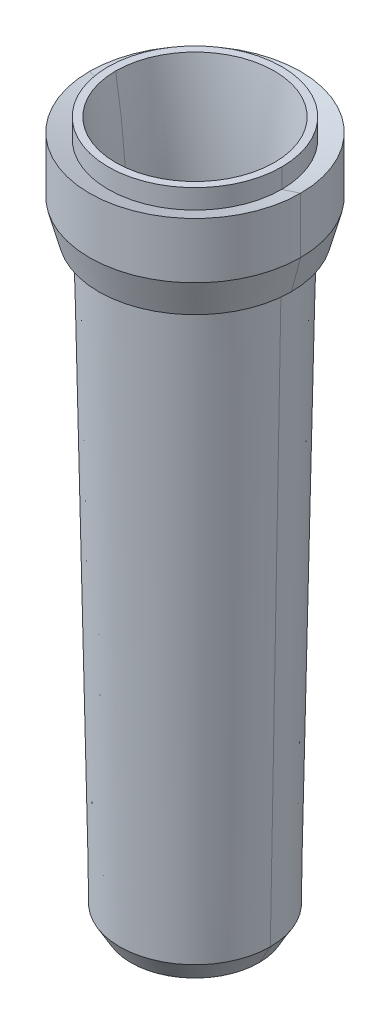
ISO-10303-21;
HEADER;
FILE_DESCRIPTION(('STEP AP214'),'2;1');
FILE_NAME('part.step','',(''),(''),'','','');
FILE_SCHEMA(('AUTOMOTIVE_DESIGN { 1 0 10303 214 1 1 1 1 }'));
ENDSEC;
DATA;
#1=APPLICATION_CONTEXT('core data for automotive mechanical design processes');
#2=APPLICATION_PROTOCOL_DEFINITION('international standard','automotive_design',2000,#1);
#3=PRODUCT_CONTEXT('',#1,'mechanical');
#4=PRODUCT('Part','Part','',(#3));
#5=PRODUCT_RELATED_PRODUCT_CATEGORY('part','',(#4));
#6=PRODUCT_DEFINITION_FORMATION('','',#4);
#7=PRODUCT_DEFINITION_CONTEXT('part definition',#1,'design');
#8=PRODUCT_DEFINITION('design','',#6,#7);
#9=PRODUCT_DEFINITION_SHAPE('','',#8);
#10=(LENGTH_UNIT() NAMED_UNIT(*) SI_UNIT(.MILLI.,.METRE.));
#11=(NAMED_UNIT(*) PLANE_ANGLE_UNIT() SI_UNIT($,.RADIAN.));
#12=(NAMED_UNIT(*) SI_UNIT($,.STERADIAN.) SOLID_ANGLE_UNIT());
#13=UNCERTAINTY_MEASURE_WITH_UNIT(LENGTH_MEASURE(1.E-05),#10,'distance_accuracy_value','');
#14=(GEOMETRIC_REPRESENTATION_CONTEXT(3) GLOBAL_UNCERTAINTY_ASSIGNED_CONTEXT((#13)) GLOBAL_UNIT_ASSIGNED_CONTEXT((#10,
#11,#12)) REPRESENTATION_CONTEXT('',''));
#15=CARTESIAN_POINT('',(0.,0.,0.));
#16=DIRECTION('',(0.,0.,1.));
#17=DIRECTION('',(1.,0.,0.));
#18=AXIS2_PLACEMENT_3D('',#15,#16,#17);
#19=CARTESIAN_POINT('',(0.,-1.57,0.));
#20=DIRECTION('',(0.,-1.,0.));
#21=DIRECTION('',(0.,0.,-1.));
#22=AXIS2_PLACEMENT_3D('',#19,#20,#21);
#23=PLANE('',#22);
#24=CARTESIAN_POINT('',(0.,-1.57,0.));
#25=DIRECTION('',(0.,-1.,0.));
#26=DIRECTION('',(1.,0.,0.));
#27=AXIS2_PLACEMENT_3D('',#24,#25,#26);
#28=CIRCLE('',#27,2.138996329813);
#29=CARTESIAN_POINT('',(2.138996329813,-1.57,0.));
#30=VERTEX_POINT('',#29);
#31=CARTESIAN_POINT('',(-2.138996329813,-1.57,0.));
#32=VERTEX_POINT('',#31);
#33=EDGE_CURVE('E11',#30,#32,#28,.T.);
#34=ORIENTED_EDGE('',*,*,#33,.T.);
#35=CARTESIAN_POINT('',(0.,-1.57,0.));
#36=DIRECTION('',(0.,1.,0.));
#37=DIRECTION('',(1.,0.,0.));
#38=AXIS2_PLACEMENT_3D('',#35,#36,#37);
#39=CIRCLE('',#38,2.138996329813);
#40=EDGE_CURVE('E157',#30,#32,#39,.T.);
#41=ORIENTED_EDGE('',*,*,#40,.F.);
#42=EDGE_LOOP('',(#34,#41));
#43=FACE_BOUND('',#42,.T.);
#44=ADVANCED_FACE('F16',(#43),#23,.T.);
#45=CARTESIAN_POINT('',(0.,-1.244448704932,0.));
#46=DIRECTION('',(0.,1.,0.));
#47=DIRECTION('',(1.,0.,0.));
#48=AXIS2_PLACEMENT_3D('',#45,#46,#47);
#49=CONICAL_SURFACE('',#48,2.326953457655,0.5235987755982);
#50=CARTESIAN_POINT('',(0.,-0.918897409864,0.));
#51=DIRECTION('',(0.,-1.,0.));
#52=DIRECTION('',(1.,0.,0.));
#53=AXIS2_PLACEMENT_3D('',#50,#51,#52);
#54=CIRCLE('',#53,2.514910585498);
#55=CARTESIAN_POINT('',(2.514910585498,-0.918897409864,0.));
#56=VERTEX_POINT('',#55);
#57=CARTESIAN_POINT('',(-2.514910585498,-0.918897409864,0.));
#58=VERTEX_POINT('',#57);
#59=EDGE_CURVE('E425',#56,#58,#54,.T.);
#60=ORIENTED_EDGE('',*,*,#59,.T.);
#61=DIRECTION('',(-0.500000000000017,0.866025403784429,0.));
#62=VECTOR('',#61,1.);
#63=CARTESIAN_POINT('',(-2.138996329813,-1.57,0.));
#64=LINE('',#63,#62);
#65=EDGE_CURVE('E411',#32,#58,#64,.T.);
#66=ORIENTED_EDGE('',*,*,#65,.F.);
#67=ORIENTED_EDGE('',*,*,#33,.F.);
#68=DIRECTION('',(0.500000000000017,0.866025403784429,0.));
#69=VECTOR('',#68,1.);
#70=CARTESIAN_POINT('',(2.138996329813,-1.57,0.));
#71=LINE('',#70,#69);
#72=EDGE_CURVE('E29',#30,#56,#71,.T.);
#73=ORIENTED_EDGE('',*,*,#72,.T.);
#74=EDGE_LOOP('',(#60,#66,#67,#73));
#75=FACE_BOUND('',#74,.T.);
#76=ADVANCED_FACE('F302',(#75),#49,.T.);
#77=CARTESIAN_POINT('',(0.,-1.244448704932,0.));
#78=DIRECTION('',(0.,1.,0.));
#79=DIRECTION('',(1.,0.,0.));
#80=AXIS2_PLACEMENT_3D('',#77,#78,#79);
#81=CONICAL_SURFACE('',#80,2.326953457655,0.5235987755982);
#82=ORIENTED_EDGE('',*,*,#40,.T.);
#83=ORIENTED_EDGE('',*,*,#65,.T.);
#84=CARTESIAN_POINT('',(0.,-0.918897409864,0.));
#85=DIRECTION('',(0.,1.,0.));
#86=DIRECTION('',(1.,0.,0.));
#87=AXIS2_PLACEMENT_3D('',#84,#85,#86);
#88=CIRCLE('',#87,2.514910585498);
#89=EDGE_CURVE('E194',#56,#58,#88,.T.);
#90=ORIENTED_EDGE('',*,*,#89,.F.);
#91=ORIENTED_EDGE('',*,*,#72,.F.);
#92=EDGE_LOOP('',(#82,#83,#90,#91));
#93=FACE_BOUND('',#92,.T.);
#94=ADVANCED_FACE('F301',(#93),#81,.T.);
#95=CARTESIAN_POINT('',(0.,0.141409378539,0.));
#96=DIRECTION('',(0.,1.,0.));
#97=DIRECTION('',(1.,0.,0.));
#98=AXIS2_PLACEMENT_3D('',#95,#96,#97);
#99=CONICAL_SURFACE('',#98,0.1357971136865,0.765155137383055);
#100=DIRECTION('',(-0.692648903600379,0.721274910378278,0.));
#101=VECTOR('',#100,1.);
#102=CARTESIAN_POINT('',(0.,0.,0.));
#103=LINE('',#102,#101);
#104=CARTESIAN_POINT('',(0.,0.,0.));
#105=VERTEX_POINT('',#104);
#106=CARTESIAN_POINT('',(-0.25,0.2603320768391,0.));
#107=VERTEX_POINT('',#106);
#108=EDGE_CURVE('E145',#105,#107,#103,.T.);
#109=ORIENTED_EDGE('',*,*,#108,.T.);
#110=CARTESIAN_POINT('',(0.,0.2603320768391,0.));
#111=DIRECTION('',(0.,-1.,0.));
#112=DIRECTION('',(1.,0.,0.));
#113=AXIS2_PLACEMENT_3D('',#110,#111,#112);
#114=CIRCLE('',#113,0.25);
#115=CARTESIAN_POINT('',(0.25,0.2603320768391,0.));
#116=VERTEX_POINT('',#115);
#117=EDGE_CURVE('E171',#116,#107,#114,.T.);
#118=ORIENTED_EDGE('',*,*,#117,.F.);
#119=DIRECTION('',(0.692648903600379,0.721274910378278,0.));
#120=VECTOR('',#119,1.);
#121=CARTESIAN_POINT('',(0.,0.,0.));
#122=LINE('',#121,#120);
#123=EDGE_CURVE('E151',#105,#116,#122,.T.);
#124=ORIENTED_EDGE('',*,*,#123,.F.);
#125=EDGE_LOOP('',(#109,#118,#124));
#126=FACE_BOUND('',#125,.T.);
#127=ADVANCED_FACE('F178',(#126),#99,.F.);
#128=CARTESIAN_POINT('',(0.,0.141409378539,0.));
#129=DIRECTION('',(0.,1.,0.));
#130=DIRECTION('',(1.,0.,0.));
#131=AXIS2_PLACEMENT_3D('',#128,#129,#130);
#132=CONICAL_SURFACE('',#131,0.1357971136865,0.765155137383055);
#133=CARTESIAN_POINT('',(0.,0.2603320768391,0.));
#134=DIRECTION('',(0.,1.,0.));
#135=DIRECTION('',(1.,0.,0.));
#136=AXIS2_PLACEMENT_3D('',#133,#134,#135);
#137=CIRCLE('',#136,0.25);
#138=EDGE_CURVE('E154',#116,#107,#137,.T.);
#139=ORIENTED_EDGE('',*,*,#138,.T.);
#140=ORIENTED_EDGE('',*,*,#108,.F.);
#141=ORIENTED_EDGE('',*,*,#123,.T.);
#142=EDGE_LOOP('',(#139,#140,#141));
#143=FACE_BOUND('',#142,.T.);
#144=ADVANCED_FACE('F153',(#143),#132,.F.);
#145=CARTESIAN_POINT('',(0.,-1.0915,0.));
#146=DIRECTION('',(0.,1.,0.));
#147=DIRECTION('',(1.,0.,0.));
#148=AXIS2_PLACEMENT_3D('',#145,#146,#147);
#149=CYLINDRICAL_SURFACE('',#148,0.25);
#150=CARTESIAN_POINT('',(0.,6.26033206936668,0.));
#151=DIRECTION('',(0.,-1.,0.));
#152=DIRECTION('',(-1.,0.,0.));
#153=AXIS2_PLACEMENT_3D('',#150,#151,#152);
#154=CIRCLE('',#153,0.249980669409341);
#155=CARTESIAN_POINT('',(0.25,6.260332076839,0.));
#156=VERTEX_POINT('',#155);
#157=CARTESIAN_POINT('',(-0.25,6.260332076839,0.));
#158=VERTEX_POINT('',#157);
#159=EDGE_CURVE('E281',#156,#158,#154,.F.);
#160=ORIENTED_EDGE('',*,*,#159,.T.);
#161=DIRECTION('',(0.,1.,0.));
#162=VECTOR('',#161,1.);
#163=CARTESIAN_POINT('',(-0.25,0.2603320768391,0.));
#164=LINE('',#163,#162);
#165=EDGE_CURVE('E165',#107,#158,#164,.T.);
#166=ORIENTED_EDGE('',*,*,#165,.F.);
#167=ORIENTED_EDGE('',*,*,#138,.F.);
#168=DIRECTION('',(0.,1.,0.));
#169=VECTOR('',#168,1.);
#170=CARTESIAN_POINT('',(0.25,0.2603320768391,0.));
#171=LINE('',#170,#169);
#172=EDGE_CURVE('E163',#116,#156,#171,.T.);
#173=ORIENTED_EDGE('',*,*,#172,.T.);
#174=EDGE_LOOP('',(#160,#166,#167,#173));
#175=FACE_BOUND('',#174,.T.);
#176=ADVANCED_FACE('F162',(#175),#149,.F.);
#177=CARTESIAN_POINT('',(0.,-1.0915,0.));
#178=DIRECTION('',(0.,1.,0.));
#179=DIRECTION('',(1.,0.,0.));
#180=AXIS2_PLACEMENT_3D('',#177,#178,#179);
#181=CYLINDRICAL_SURFACE('',#180,0.25);
#182=ORIENTED_EDGE('',*,*,#117,.T.);
#183=ORIENTED_EDGE('',*,*,#165,.T.);
#184=CARTESIAN_POINT('',(0.,6.26033206936668,0.));
#185=DIRECTION('',(0.,-1.,0.));
#186=DIRECTION('',(1.,0.,0.));
#187=AXIS2_PLACEMENT_3D('',#184,#185,#186);
#188=CIRCLE('',#187,0.249980669409341);
#189=EDGE_CURVE('E173',#156,#158,#188,.T.);
#190=ORIENTED_EDGE('',*,*,#189,.F.);
#191=ORIENTED_EDGE('',*,*,#172,.F.);
#192=EDGE_LOOP('',(#182,#183,#190,#191));
#193=FACE_BOUND('',#192,.T.);
#194=ADVANCED_FACE('F170',(#193),#181,.F.);
#195=CARTESIAN_POINT('',(2.57382221665123,15.4841499884557,0.));
#196=CARTESIAN_POINT('',(1.95945248093427,13.9917255429627,0.));
#197=CARTESIAN_POINT('',(1.13279887240373,11.71838197106,0.));
#198=CARTESIAN_POINT('',(0.416246142669461,8.63229623019272,0.));
#199=CARTESIAN_POINT('',(0.249674892083353,7.05136569587102,0.));
#200=CARTESIAN_POINT('',(0.249980669409341,6.26033206936668,0.));
#201=(BOUNDED_CURVE() B_SPLINE_CURVE(3,(#195,#196,#197,#198,#199,#200),.UNSPECIFIED.,.F.,
.F.) B_SPLINE_CURVE_WITH_KNOTS((4,1,1,4),(0.00968730510452587,0.5,0.75,0.990302962062081),
.UNSPECIFIED.) CURVE() GEOMETRIC_REPRESENTATION_ITEM() RATIONAL_B_SPLINE_CURVE((1.,1.,1.,1.,1.,1.)) REPRESENTATION_ITEM(''));
#202=CARTESIAN_POINT('',(0.,-1.0915,0.));
#203=DIRECTION('',(0.,-1.,0.));
#204=AXIS1_PLACEMENT('',#202,#203);
#205=SURFACE_OF_REVOLUTION('',#201,#204);
#206=ORIENTED_EDGE('',*,*,#189,.T.);
#207=CARTESIAN_POINT('',(-0.249980669409341,6.26033206936668,0.));
#208=CARTESIAN_POINT('',(-0.249875017405755,6.46118218266137,0.));
#209=CARTESIAN_POINT('',(-0.255107845424322,6.661978975469,0.));
#210=CARTESIAN_POINT('',(-0.275106480490465,7.06169565876627,0.));
#211=CARTESIAN_POINT('',(-0.289805266538017,7.26061884524563,0.));
#212=CARTESIAN_POINT('',(-0.327539887605495,7.65679257361257,0.));
#213=CARTESIAN_POINT('',(-0.350539799327283,7.85404663056385,0.));
#214=CARTESIAN_POINT('',(-0.403639578730738,8.24713069560148,0.));
#215=CARTESIAN_POINT('',(-0.43372334026497,8.44296291030107,0.));
#216=CARTESIAN_POINT('',(-0.499825951872483,8.83343831736606,0.));
#217=CARTESIAN_POINT('',(-0.535839578425352,9.02808240122136,0.));
#218=CARTESIAN_POINT('',(-0.613315300089928,9.4162847366823,0.));
#219=CARTESIAN_POINT('',(-0.654777602764003,9.60984294662953,0.));
#220=CARTESIAN_POINT('',(-0.786624057948663,10.1893305091279,0.));
#221=CARTESIAN_POINT('',(-0.884383028768772,10.5735877945515,0.));
#222=CARTESIAN_POINT('',(-1.0955144226818,11.3389572512008,0.));
#223=CARTESIAN_POINT('',(-1.2089327413911,11.720056552305,0.));
#224=CARTESIAN_POINT('',(-1.44955105769857,12.4795139404051,0.));
#225=CARTESIAN_POINT('',(-1.57680339676708,12.8578553989923,0.));
#226=CARTESIAN_POINT('',(-1.84325235196437,13.6121461262986,0.));
#227=CARTESIAN_POINT('',(-1.9824989502444,13.9880776022946,0.));
#228=CARTESIAN_POINT('',(-2.27113969915432,14.7379419450987,0.));
#229=CARTESIAN_POINT('',(-2.42057597572934,15.1118586372032,0.));
#230=CARTESIAN_POINT('',(-2.57382221665123,15.4841499884557,0.));
#231=B_SPLINE_CURVE_WITH_KNOTS('',3,(#207,#208,#209,#210,#211,#212,#213,#214,#215,#216,#217,
#218,#219,#220,#221,#222,#223,#224,#225,#226,#227,#228,#229,#230),.UNSPECIFIED.,.F.,.F.,(4,2,2,
2,2,2,2,2,2,2,2,4),(0.,0.602398392345644,1.20057788025439,1.79619917652653,2.39047910036153,
2.98423830622876,3.57802013737399,4.76705893035003,5.95965970371639,7.15694103369231,
8.3594783396622,9.56733007035676),.UNSPECIFIED.);
#232=CARTESIAN_POINT('',(-2.573827363621,15.48414786966,0.));
#233=VERTEX_POINT('',#232);
#234=EDGE_CURVE('E263',#158,#233,#231,.T.);
#235=ORIENTED_EDGE('',*,*,#234,.T.);
#236=CARTESIAN_POINT('',(0.,15.48414786966,0.));
#237=DIRECTION('',(0.,-1.,0.));
#238=DIRECTION('',(1.,0.,0.));
#239=AXIS2_PLACEMENT_3D('',#236,#237,#238);
#240=CIRCLE('',#239,2.573827363621);
#241=CARTESIAN_POINT('',(2.573827363621,15.48414786966,0.));
#242=VERTEX_POINT('',#241);
#243=EDGE_CURVE('E272',#242,#233,#240,.T.);
#244=ORIENTED_EDGE('',*,*,#243,.F.);
#245=CARTESIAN_POINT('',(0.249980669409341,6.26033206936668,0.));
#246=CARTESIAN_POINT('',(0.249875017405755,6.46118218266138,0.));
#247=CARTESIAN_POINT('',(0.255107845424322,6.661978975469,0.));
#248=CARTESIAN_POINT('',(0.275106480490465,7.06169565876627,0.));
#249=CARTESIAN_POINT('',(0.289805266538017,7.26061884524563,0.));
#250=CARTESIAN_POINT('',(0.327539887605495,7.65679257361257,0.));
#251=CARTESIAN_POINT('',(0.350539799327283,7.85404663056385,0.));
#252=CARTESIAN_POINT('',(0.403639578730738,8.24713069560148,0.));
#253=CARTESIAN_POINT('',(0.43372334026497,8.44296291030107,0.));
#254=CARTESIAN_POINT('',(0.499825951872483,8.83343831736606,0.));
#255=CARTESIAN_POINT('',(0.535839578425352,9.02808240122136,0.));
#256=CARTESIAN_POINT('',(0.613315300089928,9.4162847366823,0.));
#257=CARTESIAN_POINT('',(0.654777602764003,9.60984294662953,0.));
#258=CARTESIAN_POINT('',(0.786624057948663,10.1893305091279,0.));
#259=CARTESIAN_POINT('',(0.884383028768772,10.5735877945515,0.));
#260=CARTESIAN_POINT('',(1.0955144226818,11.3389572512008,0.));
#261=CARTESIAN_POINT('',(1.2089327413911,11.720056552305,0.));
#262=CARTESIAN_POINT('',(1.44955105769857,12.4795139404051,0.));
#263=CARTESIAN_POINT('',(1.57680339676708,12.8578553989923,0.));
#264=CARTESIAN_POINT('',(1.84325235196437,13.6121461262986,0.));
#265=CARTESIAN_POINT('',(1.9824989502444,13.9880776022946,0.));
#266=CARTESIAN_POINT('',(2.27113969915432,14.7379419450987,0.));
#267=CARTESIAN_POINT('',(2.42057597572934,15.1118586372032,0.));
#268=CARTESIAN_POINT('',(2.57382221665123,15.4841499884557,0.));
#269=B_SPLINE_CURVE_WITH_KNOTS('',3,(#245,#246,#247,#248,#249,#250,#251,#252,#253,#254,#255,
#256,#257,#258,#259,#260,#261,#262,#263,#264,#265,#266,#267,#268),.UNSPECIFIED.,.F.,.F.,(4,2,2,
2,2,2,2,2,2,2,2,4),(0.,0.602398392345642,1.20057788025439,1.79619917652653,2.39047910036153,
2.98423830622875,3.57802013737399,4.76705893035002,5.95965970371638,7.15694103369231,
8.35947833966219,9.56733007035676),.UNSPECIFIED.);
#270=EDGE_CURVE('E189',#156,#242,#269,.T.);
#271=ORIENTED_EDGE('',*,*,#270,.F.);
#272=EDGE_LOOP('',(#206,#235,#244,#271));
#273=FACE_BOUND('',#272,.T.);
#274=ADVANCED_FACE('F235',(#273),#205,.F.);
#275=CARTESIAN_POINT('',(2.57382221665123,15.4841499884557,0.));
#276=CARTESIAN_POINT('',(1.95945248093427,13.9917255429627,0.));
#277=CARTESIAN_POINT('',(1.13279887240373,11.71838197106,0.));
#278=CARTESIAN_POINT('',(0.416246142669461,8.63229623019272,0.));
#279=CARTESIAN_POINT('',(0.249674892083353,7.05136569587102,0.));
#280=CARTESIAN_POINT('',(0.249980669409341,6.26033206936668,0.));
#281=(BOUNDED_CURVE() B_SPLINE_CURVE(3,(#275,#276,#277,#278,#279,#280),.UNSPECIFIED.,.F.,
.F.) B_SPLINE_CURVE_WITH_KNOTS((4,1,1,4),(0.00968730510452587,0.5,0.75,0.990302962062081),
.UNSPECIFIED.) CURVE() GEOMETRIC_REPRESENTATION_ITEM() RATIONAL_B_SPLINE_CURVE((1.,1.,1.,1.,1.,1.)) REPRESENTATION_ITEM(''));
#282=CARTESIAN_POINT('',(0.,-1.0915,0.));
#283=DIRECTION('',(0.,-1.,0.));
#284=AXIS1_PLACEMENT('',#282,#283);
#285=SURFACE_OF_REVOLUTION('',#281,#284);
#286=CARTESIAN_POINT('',(0.,15.48414786966,0.));
#287=DIRECTION('',(0.,1.,0.));
#288=DIRECTION('',(1.,0.,0.));
#289=AXIS2_PLACEMENT_3D('',#286,#287,#288);
#290=CIRCLE('',#289,2.573827363621);
#291=EDGE_CURVE('E254',#242,#233,#290,.T.);
#292=ORIENTED_EDGE('',*,*,#291,.T.);
#293=ORIENTED_EDGE('',*,*,#234,.F.);
#294=ORIENTED_EDGE('',*,*,#159,.F.);
#295=ORIENTED_EDGE('',*,*,#270,.T.);
#296=EDGE_LOOP('',(#292,#293,#294,#295));
#297=FACE_BOUND('',#296,.T.);
#298=ADVANCED_FACE('F18',(#297),#285,.F.);
#299=CARTESIAN_POINT('',(0.,-1.0915,0.));
#300=DIRECTION('',(0.,1.,0.));
#301=DIRECTION('',(1.,0.,0.));
#302=AXIS2_PLACEMENT_3D('',#299,#300,#301);
#303=CYLINDRICAL_SURFACE('',#302,2.573827363621);
#304=CARTESIAN_POINT('',(0.,17.67821197515,0.));
#305=DIRECTION('',(0.,1.,0.));
#306=DIRECTION('',(1.,0.,0.));
#307=AXIS2_PLACEMENT_3D('',#304,#305,#306);
#308=CIRCLE('',#307,2.573827363621);
#309=CARTESIAN_POINT('',(2.573827363621,17.67821197515,0.));
#310=VERTEX_POINT('',#309);
#311=CARTESIAN_POINT('',(-2.573827363621,17.67821197515,0.));
#312=VERTEX_POINT('',#311);
#313=EDGE_CURVE('E395',#310,#312,#308,.T.);
#314=ORIENTED_EDGE('',*,*,#313,.T.);
#315=DIRECTION('',(0.,1.,0.));
#316=VECTOR('',#315,1.);
#317=CARTESIAN_POINT('',(-2.573827363621,15.48414786966,0.));
#318=LINE('',#317,#316);
#319=EDGE_CURVE('E269',#233,#312,#318,.T.);
#320=ORIENTED_EDGE('',*,*,#319,.F.);
#321=ORIENTED_EDGE('',*,*,#291,.F.);
#322=DIRECTION('',(0.,1.,0.));
#323=VECTOR('',#322,1.);
#324=CARTESIAN_POINT('',(2.573827363621,15.48414786966,0.));
#325=LINE('',#324,#323);
#326=EDGE_CURVE('E264',#242,#310,#325,.T.);
#327=ORIENTED_EDGE('',*,*,#326,.T.);
#328=EDGE_LOOP('',(#314,#320,#321,#327));
#329=FACE_BOUND('',#328,.T.);
#330=ADVANCED_FACE('F527',(#329),#303,.F.);
#331=CARTESIAN_POINT('',(0.,-1.0915,0.));
#332=DIRECTION('',(0.,1.,0.));
#333=DIRECTION('',(1.,0.,0.));
#334=AXIS2_PLACEMENT_3D('',#331,#332,#333);
#335=CYLINDRICAL_SURFACE('',#334,2.573827363621);
#336=ORIENTED_EDGE('',*,*,#243,.T.);
#337=ORIENTED_EDGE('',*,*,#319,.T.);
#338=CARTESIAN_POINT('',(0.,17.67821197515,0.));
#339=DIRECTION('',(0.,-1.,0.));
#340=DIRECTION('',(1.,0.,0.));
#341=AXIS2_PLACEMENT_3D('',#338,#339,#340);
#342=CIRCLE('',#341,2.573827363621);
#343=EDGE_CURVE('E276',#310,#312,#342,.T.);
#344=ORIENTED_EDGE('',*,*,#343,.F.);
#345=ORIENTED_EDGE('',*,*,#326,.F.);
#346=EDGE_LOOP('',(#336,#337,#344,#345));
#347=FACE_BOUND('',#346,.T.);
#348=ADVANCED_FACE('F523',(#347),#335,.F.);
#349=CARTESIAN_POINT('',(0.,17.67821197515,0.));
#350=DIRECTION('',(0.,1.,0.));
#351=DIRECTION('',(1.,0.,0.));
#352=AXIS2_PLACEMENT_3D('',#349,#350,#351);
#353=PLANE('',#352);
#354=CARTESIAN_POINT('',(0.,17.67821197515,0.));
#355=DIRECTION('',(0.,-1.,0.));
#356=DIRECTION('',(1.,0.,0.));
#357=AXIS2_PLACEMENT_3D('',#354,#355,#356);
#358=CIRCLE('',#357,2.275);
#359=CARTESIAN_POINT('',(2.275,17.67821197515,0.));
#360=VERTEX_POINT('',#359);
#361=CARTESIAN_POINT('',(-2.275,17.67821197515,0.));
#362=VERTEX_POINT('',#361);
#363=EDGE_CURVE('E382',#360,#362,#358,.T.);
#364=ORIENTED_EDGE('',*,*,#363,.F.);
#365=CARTESIAN_POINT('',(0.,17.67821197515,0.));
#366=DIRECTION('',(0.,1.,0.));
#367=DIRECTION('',(1.,0.,0.));
#368=AXIS2_PLACEMENT_3D('',#365,#366,#367);
#369=CIRCLE('',#368,2.275);
#370=EDGE_CURVE('E219',#360,#362,#369,.T.);
#371=ORIENTED_EDGE('',*,*,#370,.T.);
#372=EDGE_LOOP('',(#364,#371));
#373=FACE_BOUND('',#372,.T.);
#374=ORIENTED_EDGE('',*,*,#313,.F.);
#375=ORIENTED_EDGE('',*,*,#343,.T.);
#376=EDGE_LOOP('',(#374,#375));
#377=FACE_BOUND('',#376,.T.);
#378=ADVANCED_FACE('F519',(#373,#377),#353,.F.);
#379=CARTESIAN_POINT('',(0.,-1.0915,0.));
#380=DIRECTION('',(0.,1.,0.));
#381=DIRECTION('',(1.,0.,0.));
#382=AXIS2_PLACEMENT_3D('',#379,#380,#381);
#383=CYLINDRICAL_SURFACE('',#382,2.275);
#384=CARTESIAN_POINT('',(0.,17.97821197515,0.));
#385=DIRECTION('',(0.,1.,0.));
#386=DIRECTION('',(1.,0.,0.));
#387=AXIS2_PLACEMENT_3D('',#384,#385,#386);
#388=CIRCLE('',#387,2.275);
#389=CARTESIAN_POINT('',(2.275,17.97821197515,0.));
#390=VERTEX_POINT('',#389);
#391=CARTESIAN_POINT('',(-2.275,17.97821197515,0.));
#392=VERTEX_POINT('',#391);
#393=EDGE_CURVE('E389',#390,#392,#388,.T.);
#394=ORIENTED_EDGE('',*,*,#393,.T.);
#395=DIRECTION('',(0.,1.,0.));
#396=VECTOR('',#395,1.);
#397=CARTESIAN_POINT('',(-2.275,17.67821197515,0.));
#398=LINE('',#397,#396);
#399=EDGE_CURVE('E220',#362,#392,#398,.T.);
#400=ORIENTED_EDGE('',*,*,#399,.F.);
#401=ORIENTED_EDGE('',*,*,#370,.F.);
#402=DIRECTION('',(0.,1.,0.));
#403=VECTOR('',#402,1.);
#404=CARTESIAN_POINT('',(2.275,17.67821197515,0.));
#405=LINE('',#404,#403);
#406=EDGE_CURVE('E216',#360,#390,#405,.T.);
#407=ORIENTED_EDGE('',*,*,#406,.T.);
#408=EDGE_LOOP('',(#394,#400,#401,#407));
#409=FACE_BOUND('',#408,.T.);
#410=ADVANCED_FACE('F516',(#409),#383,.F.);
#411=CARTESIAN_POINT('',(0.,-1.0915,0.));
#412=DIRECTION('',(0.,1.,0.));
#413=DIRECTION('',(1.,0.,0.));
#414=AXIS2_PLACEMENT_3D('',#411,#412,#413);
#415=CYLINDRICAL_SURFACE('',#414,2.275);
#416=ORIENTED_EDGE('',*,*,#363,.T.);
#417=ORIENTED_EDGE('',*,*,#399,.T.);
#418=CARTESIAN_POINT('',(0.,17.97821197515,0.));
#419=DIRECTION('',(0.,-1.,0.));
#420=DIRECTION('',(1.,0.,0.));
#421=AXIS2_PLACEMENT_3D('',#418,#419,#420);
#422=CIRCLE('',#421,2.275);
#423=EDGE_CURVE('E385',#390,#392,#422,.T.);
#424=ORIENTED_EDGE('',*,*,#423,.F.);
#425=ORIENTED_EDGE('',*,*,#406,.F.);
#426=EDGE_LOOP('',(#416,#417,#424,#425));
#427=FACE_BOUND('',#426,.T.);
#428=ADVANCED_FACE('F343',(#427),#415,.F.);
#429=CARTESIAN_POINT('',(0.,17.44029966411,0.));
#430=DIRECTION('',(0.,1.,0.));
#431=DIRECTION('',(1.,0.,0.));
#432=AXIS2_PLACEMENT_3D('',#429,#430,#431);
#433=TOROIDAL_SURFACE('',#432,27.76932584607,25.5);
#434=CARTESIAN_POINT('',(27.76932584607,17.44029966411,0.));
#435=DIRECTION('',(0.,0.,-1.));
#436=DIRECTION('',(-0.999777484159641,0.0210946004327808,0.));
#437=AXIS2_PLACEMENT_3D('',#434,#435,#436);
#438=CIRCLE('',#437,25.5);
#439=CARTESIAN_POINT('',(2.65,21.83,0.));
#440=VERTEX_POINT('',#439);
#441=EDGE_CURVE('E386',#390,#440,#438,.T.);
#442=ORIENTED_EDGE('',*,*,#441,.F.);
#443=ORIENTED_EDGE('',*,*,#423,.T.);
#444=CARTESIAN_POINT('',(-27.76932584607,17.44029966411,0.));
#445=DIRECTION('',(0.,0.,1.));
#446=DIRECTION('',(0.999777484159641,0.0210946004327808,0.));
#447=AXIS2_PLACEMENT_3D('',#444,#445,#446);
#448=CIRCLE('',#447,25.5);
#449=CARTESIAN_POINT('',(-2.65,21.83,0.));
#450=VERTEX_POINT('',#449);
#451=EDGE_CURVE('E400',#392,#450,#448,.T.);
#452=ORIENTED_EDGE('',*,*,#451,.T.);
#453=CARTESIAN_POINT('',(0.,21.83,0.));
#454=DIRECTION('',(0.,1.,0.));
#455=DIRECTION('',(-1.,0.,0.));
#456=AXIS2_PLACEMENT_3D('',#453,#454,#455);
#457=CIRCLE('',#456,2.65);
#458=EDGE_CURVE('E214',#450,#440,#457,.T.);
#459=ORIENTED_EDGE('',*,*,#458,.T.);
#460=EDGE_LOOP('',(#442,#443,#452,#459));
#461=FACE_BOUND('',#460,.T.);
#462=ADVANCED_FACE('F471',(#461),#433,.T.);
#463=CARTESIAN_POINT('',(0.,17.44029966411,0.));
#464=DIRECTION('',(0.,1.,0.));
#465=DIRECTION('',(1.,0.,0.));
#466=AXIS2_PLACEMENT_3D('',#463,#464,#465);
#467=TOROIDAL_SURFACE('',#466,27.76932584607,25.5);
#468=ORIENTED_EDGE('',*,*,#451,.F.);
#469=ORIENTED_EDGE('',*,*,#393,.F.);
#470=ORIENTED_EDGE('',*,*,#441,.T.);
#471=CARTESIAN_POINT('',(0.,21.83,0.));
#472=DIRECTION('',(0.,1.,0.));
#473=DIRECTION('',(1.,0.,0.));
#474=AXIS2_PLACEMENT_3D('',#471,#472,#473);
#475=CIRCLE('',#474,2.65);
#476=EDGE_CURVE('E396',#440,#450,#475,.T.);
#477=ORIENTED_EDGE('',*,*,#476,.T.);
#478=EDGE_LOOP('',(#468,#469,#470,#477));
#479=FACE_BOUND('',#478,.T.);
#480=ADVANCED_FACE('F477',(#479),#467,.T.);
#481=CARTESIAN_POINT('',(0.,21.83,0.));
#482=DIRECTION('',(0.,-1.,0.));
#483=DIRECTION('',(0.,0.,-1.));
#484=AXIS2_PLACEMENT_3D('',#481,#482,#483);
#485=PLANE('',#484);
#486=ORIENTED_EDGE('',*,*,#458,.F.);
#487=ORIENTED_EDGE('',*,*,#476,.F.);
#488=EDGE_LOOP('',(#486,#487));
#489=FACE_BOUND('',#488,.T.);
#490=CARTESIAN_POINT('',(0.,21.83,0.));
#491=DIRECTION('',(0.,-1.,0.));
#492=DIRECTION('',(1.,0.,0.));
#493=AXIS2_PLACEMENT_3D('',#490,#491,#492);
#494=CIRCLE('',#493,2.9);
#495=CARTESIAN_POINT('',(2.9,21.83,0.));
#496=VERTEX_POINT('',#495);
#497=CARTESIAN_POINT('',(-2.9,21.83,0.));
#498=VERTEX_POINT('',#497);
#499=EDGE_CURVE('E203',#496,#498,#494,.T.);
#500=ORIENTED_EDGE('',*,*,#499,.F.);
#501=CARTESIAN_POINT('',(0.,21.83,0.));
#502=DIRECTION('',(0.,1.,0.));
#503=DIRECTION('',(1.,0.,0.));
#504=AXIS2_PLACEMENT_3D('',#501,#502,#503);
#505=CIRCLE('',#504,2.9);
#506=EDGE_CURVE('E211',#496,#498,#505,.T.);
#507=ORIENTED_EDGE('',*,*,#506,.T.);
#508=EDGE_LOOP('',(#500,#507));
#509=FACE_BOUND('',#508,.T.);
#510=ADVANCED_FACE('F310',(#489,#509),#485,.F.);
#511=CARTESIAN_POINT('',(0.,23.,0.));
#512=DIRECTION('',(0.,-1.,0.));
#513=DIRECTION('',(-1.,0.,0.));
#514=AXIS2_PLACEMENT_3D('',#511,#512,#513);
#515=CYLINDRICAL_SURFACE('',#514,2.9);
#516=CARTESIAN_POINT('',(0.,21.18,0.));
#517=DIRECTION('',(0.,1.,0.));
#518=DIRECTION('',(1.,0.,0.));
#519=AXIS2_PLACEMENT_3D('',#516,#517,#518);
#520=CIRCLE('',#519,2.9);
#521=CARTESIAN_POINT('',(2.9,21.18,0.));
#522=VERTEX_POINT('',#521);
#523=CARTESIAN_POINT('',(-2.9,21.18,0.));
#524=VERTEX_POINT('',#523);
#525=EDGE_CURVE('E446',#522,#524,#520,.T.);
#526=ORIENTED_EDGE('',*,*,#525,.T.);
#527=DIRECTION('',(0.,1.,0.));
#528=VECTOR('',#527,1.);
#529=CARTESIAN_POINT('',(-2.9,21.18,0.));
#530=LINE('',#529,#528);
#531=EDGE_CURVE('E224',#524,#498,#530,.T.);
#532=ORIENTED_EDGE('',*,*,#531,.T.);
#533=ORIENTED_EDGE('',*,*,#506,.F.);
#534=DIRECTION('',(0.,1.,0.));
#535=VECTOR('',#534,1.);
#536=CARTESIAN_POINT('',(2.9,21.18,0.));
#537=LINE('',#536,#535);
#538=EDGE_CURVE('E215',#522,#496,#537,.T.);
#539=ORIENTED_EDGE('',*,*,#538,.F.);
#540=EDGE_LOOP('',(#526,#532,#533,#539));
#541=FACE_BOUND('',#540,.T.);
#542=ADVANCED_FACE('F306',(#541),#515,.T.);
#543=CARTESIAN_POINT('',(0.,23.,0.));
#544=DIRECTION('',(0.,-1.,0.));
#545=DIRECTION('',(-1.,0.,0.));
#546=AXIS2_PLACEMENT_3D('',#543,#544,#545);
#547=CYLINDRICAL_SURFACE('',#546,2.9);
#548=ORIENTED_EDGE('',*,*,#499,.T.);
#549=ORIENTED_EDGE('',*,*,#531,.F.);
#550=CARTESIAN_POINT('',(0.,21.18,0.));
#551=DIRECTION('',(0.,-1.,0.));
#552=DIRECTION('',(1.,0.,0.));
#553=AXIS2_PLACEMENT_3D('',#550,#551,#552);
#554=CIRCLE('',#553,2.9);
#555=EDGE_CURVE('E199',#522,#524,#554,.T.);
#556=ORIENTED_EDGE('',*,*,#555,.F.);
#557=ORIENTED_EDGE('',*,*,#538,.T.);
#558=EDGE_LOOP('',(#548,#549,#556,#557));
#559=FACE_BOUND('',#558,.T.);
#560=ADVANCED_FACE('F309',(#559),#547,.T.);
#561=CARTESIAN_POINT('',(0.,21.28,0.));
#562=DIRECTION('',(0.,1.,0.));
#563=DIRECTION('',(1.,0.,0.));
#564=AXIS2_PLACEMENT_3D('',#561,#562,#563);
#565=CONICAL_SURFACE('',#564,3.2125,1.26109338225215);
#566=ORIENTED_EDGE('',*,*,#555,.T.);
#567=DIRECTION('',(0.952424147199317,-0.304775727103806,0.));
#568=VECTOR('',#567,1.);
#569=CARTESIAN_POINT('',(-3.525,21.38,0.));
#570=LINE('',#569,#568);
#571=CARTESIAN_POINT('',(-3.525,21.38,0.));
#572=VERTEX_POINT('',#571);
#573=EDGE_CURVE('E450',#572,#524,#570,.T.);
#574=ORIENTED_EDGE('',*,*,#573,.F.);
#575=CARTESIAN_POINT('',(0.,21.38,0.));
#576=DIRECTION('',(0.,-1.,0.));
#577=DIRECTION('',(1.,0.,0.));
#578=AXIS2_PLACEMENT_3D('',#575,#576,#577);
#579=CIRCLE('',#578,3.525);
#580=CARTESIAN_POINT('',(3.525,21.38,0.));
#581=VERTEX_POINT('',#580);
#582=EDGE_CURVE('E210',#581,#572,#579,.T.);
#583=ORIENTED_EDGE('',*,*,#582,.F.);
#584=DIRECTION('',(-0.952424147199317,-0.304775727103806,0.));
#585=VECTOR('',#584,1.);
#586=CARTESIAN_POINT('',(3.525,21.38,0.));
#587=LINE('',#586,#585);
#588=EDGE_CURVE('E204',#581,#522,#587,.T.);
#589=ORIENTED_EDGE('',*,*,#588,.T.);
#590=EDGE_LOOP('',(#566,#574,#583,#589));
#591=FACE_BOUND('',#590,.T.);
#592=ADVANCED_FACE('F319',(#591),#565,.F.);
#593=CARTESIAN_POINT('',(0.,21.28,0.));
#594=DIRECTION('',(0.,1.,0.));
#595=DIRECTION('',(1.,0.,0.));
#596=AXIS2_PLACEMENT_3D('',#593,#594,#595);
#597=CONICAL_SURFACE('',#596,3.2125,1.26109338225215);
#598=CARTESIAN_POINT('',(0.,21.38,0.));
#599=DIRECTION('',(0.,1.,0.));
#600=DIRECTION('',(1.,0.,0.));
#601=AXIS2_PLACEMENT_3D('',#598,#599,#600);
#602=CIRCLE('',#601,3.525);
#603=EDGE_CURVE('E209',#581,#572,#602,.T.);
#604=ORIENTED_EDGE('',*,*,#603,.T.);
#605=ORIENTED_EDGE('',*,*,#573,.T.);
#606=ORIENTED_EDGE('',*,*,#525,.F.);
#607=ORIENTED_EDGE('',*,*,#588,.F.);
#608=EDGE_LOOP('',(#604,#605,#606,#607));
#609=FACE_BOUND('',#608,.T.);
#610=ADVANCED_FACE('F347',(#609),#597,.F.);
#611=CARTESIAN_POINT('',(0.,18.94913774809,0.));
#612=DIRECTION('',(0.,1.,0.));
#613=DIRECTION('',(0.,0.,-1.));
#614=AXIS2_PLACEMENT_3D('',#611,#612,#613);
#615=CONICAL_SURFACE('',#614,3.372499999982,0.2617993877991);
#616=DIRECTION('',(-0.258819045102494,-0.965925826289076,-8.66585972191578E-11));
#617=VECTOR('',#616,1.);
#618=CARTESIAN_POINT('',(3.524999999981,19.51827549624,-4.685157021883E-10));
#619=LINE('',#618,#617);
#620=CARTESIAN_POINT('',(3.525,19.51827549631,0.));
#621=VERTEX_POINT('',#620);
#622=CARTESIAN_POINT('',(3.22,18.38,0.));
#623=VERTEX_POINT('',#622);
#624=EDGE_CURVE('E392',#621,#623,#619,.T.);
#625=ORIENTED_EDGE('',*,*,#624,.T.);
#626=CARTESIAN_POINT('',(0.,18.38,0.));
#627=DIRECTION('',(0.,1.,0.));
#628=DIRECTION('',(1.,0.,0.));
#629=AXIS2_PLACEMENT_3D('',#626,#627,#628);
#630=CIRCLE('',#629,3.22);
#631=CARTESIAN_POINT('',(-3.22,18.38,0.));
#632=VERTEX_POINT('',#631);
#633=EDGE_CURVE('E364',#623,#632,#630,.T.);
#634=ORIENTED_EDGE('',*,*,#633,.T.);
#635=DIRECTION('',(0.258819045102494,-0.965925826289076,8.66585772575078E-11));
#636=VECTOR('',#635,1.);
#637=CARTESIAN_POINT('',(-3.524999999981,19.51827549624,4.685155942663E-10));
#638=LINE('',#637,#636);
#639=CARTESIAN_POINT('',(-3.525,19.51827549631,0.));
#640=VERTEX_POINT('',#639);
#641=EDGE_CURVE('E375',#640,#632,#638,.T.);
#642=ORIENTED_EDGE('',*,*,#641,.F.);
#643=CARTESIAN_POINT('',(0.,19.51827549631,0.));
#644=DIRECTION('',(0.,1.,0.));
#645=DIRECTION('',(1.,0.,0.));
#646=AXIS2_PLACEMENT_3D('',#643,#644,#645);
#647=CIRCLE('',#646,3.525);
#648=EDGE_CURVE('E192',#621,#640,#647,.T.);
#649=ORIENTED_EDGE('',*,*,#648,.F.);
#650=EDGE_LOOP('',(#625,#634,#642,#649));
#651=FACE_BOUND('',#650,.T.);
#652=ADVANCED_FACE('F329',(#651),#615,.T.);
#653=CARTESIAN_POINT('',(0.,23.,0.));
#654=DIRECTION('',(0.,-1.,0.));
#655=DIRECTION('',(-1.,0.,0.));
#656=AXIS2_PLACEMENT_3D('',#653,#654,#655);
#657=CYLINDRICAL_SURFACE('',#656,3.525);
#658=DIRECTION('',(-1.001996337873E-11,1.,-2.516570120916E-10));
#659=VECTOR('',#658,1.);
#660=CARTESIAN_POINT('',(-3.524999999981,19.51827549624,4.685155942663E-10));
#661=LINE('',#660,#659);
#662=EDGE_CURVE('E205',#640,#572,#661,.T.);
#663=ORIENTED_EDGE('',*,*,#662,.T.);
#664=ORIENTED_EDGE('',*,*,#603,.F.);
#665=DIRECTION('',(1.002044045169E-11,1.,2.516570700604E-10));
#666=VECTOR('',#665,1.);
#667=CARTESIAN_POINT('',(3.524999999981,19.51827549624,-4.685157021883E-10));
#668=LINE('',#667,#666);
#669=EDGE_CURVE('E404',#621,#581,#668,.T.);
#670=ORIENTED_EDGE('',*,*,#669,.F.);
#671=ORIENTED_EDGE('',*,*,#648,.T.);
#672=EDGE_LOOP('',(#663,#664,#670,#671));
#673=FACE_BOUND('',#672,.T.);
#674=ADVANCED_FACE('F327',(#673),#657,.T.);
#675=CARTESIAN_POINT('',(0.,23.,0.));
#676=DIRECTION('',(0.,-1.,0.));
#677=DIRECTION('',(-1.,0.,0.));
#678=AXIS2_PLACEMENT_3D('',#675,#676,#677);
#679=CYLINDRICAL_SURFACE('',#678,3.525);
#680=ORIENTED_EDGE('',*,*,#669,.T.);
#681=ORIENTED_EDGE('',*,*,#582,.T.);
#682=ORIENTED_EDGE('',*,*,#662,.F.);
#683=CARTESIAN_POINT('',(0.,19.51827549631,0.));
#684=DIRECTION('',(0.,1.,0.));
#685=DIRECTION('',(-1.,0.,0.));
#686=AXIS2_PLACEMENT_3D('',#683,#684,#685);
#687=CIRCLE('',#686,3.525);
#688=EDGE_CURVE('E408',#640,#621,#687,.T.);
#689=ORIENTED_EDGE('',*,*,#688,.T.);
#690=EDGE_LOOP('',(#680,#681,#682,#689));
#691=FACE_BOUND('',#690,.T.);
#692=ADVANCED_FACE('F297',(#691),#679,.T.);
#693=CARTESIAN_POINT('',(0.,18.94913774809,0.));
#694=DIRECTION('',(0.,1.,0.));
#695=DIRECTION('',(0.,0.,-1.));
#696=AXIS2_PLACEMENT_3D('',#693,#694,#695);
#697=CONICAL_SURFACE('',#696,3.372499999982,0.2617993877991);
#698=ORIENTED_EDGE('',*,*,#641,.T.);
#699=CARTESIAN_POINT('',(0.,18.38,0.));
#700=DIRECTION('',(0.,1.,0.));
#701=DIRECTION('',(-1.,0.,0.));
#702=AXIS2_PLACEMENT_3D('',#699,#700,#701);
#703=CIRCLE('',#702,3.22);
#704=EDGE_CURVE('E366',#632,#623,#703,.T.);
#705=ORIENTED_EDGE('',*,*,#704,.T.);
#706=ORIENTED_EDGE('',*,*,#624,.F.);
#707=ORIENTED_EDGE('',*,*,#688,.F.);
#708=EDGE_LOOP('',(#698,#705,#706,#707));
#709=FACE_BOUND('',#708,.T.);
#710=ADVANCED_FACE('F312',(#709),#697,.T.);
#711=CARTESIAN_POINT('',(0.,18.38,0.));
#712=DIRECTION('',(0.,-1.,0.));
#713=DIRECTION('',(0.,0.,-1.));
#714=AXIS2_PLACEMENT_3D('',#711,#712,#713);
#715=PLANE('',#714);
#716=CARTESIAN_POINT('',(0.,18.38,0.));
#717=DIRECTION('',(0.,1.,0.));
#718=DIRECTION('',(1.,0.,0.));
#719=AXIS2_PLACEMENT_3D('',#716,#717,#718);
#720=CIRCLE('',#719,2.875);
#721=CARTESIAN_POINT('',(2.875,18.38,0.));
#722=VERTEX_POINT('',#721);
#723=CARTESIAN_POINT('',(-2.875,18.38,0.));
#724=VERTEX_POINT('',#723);
#725=EDGE_CURVE('E197',#722,#724,#720,.T.);
#726=ORIENTED_EDGE('',*,*,#725,.T.);
#727=CARTESIAN_POINT('',(0.,18.38,0.));
#728=DIRECTION('',(0.,-1.,0.));
#729=DIRECTION('',(1.,0.,0.));
#730=AXIS2_PLACEMENT_3D('',#727,#728,#729);
#731=CIRCLE('',#730,2.875);
#732=EDGE_CURVE('E418',#722,#724,#731,.T.);
#733=ORIENTED_EDGE('',*,*,#732,.F.);
#734=EDGE_LOOP('',(#726,#733));
#735=FACE_BOUND('',#734,.T.);
#736=ORIENTED_EDGE('',*,*,#633,.F.);
#737=ORIENTED_EDGE('',*,*,#704,.F.);
#738=EDGE_LOOP('',(#736,#737));
#739=FACE_BOUND('',#738,.T.);
#740=ADVANCED_FACE('F315',(#735,#739),#715,.T.);
#741=CARTESIAN_POINT('',(0.,8.730551295068,0.));
#742=DIRECTION('',(0.,1.,0.));
#743=DIRECTION('',(1.,0.,0.));
#744=AXIS2_PLACEMENT_3D('',#741,#742,#743);
#745=CONICAL_SURFACE('',#744,2.694955292749,0.0186563837422227);
#746=ORIENTED_EDGE('',*,*,#89,.T.);
#747=DIRECTION('',(-0.0186553015022006,0.999825974720532,0.));
#748=VECTOR('',#747,1.);
#749=CARTESIAN_POINT('',(-2.514910585498,-0.918897409864,0.));
#750=LINE('',#749,#748);
#751=EDGE_CURVE('E422',#58,#724,#750,.T.);
#752=ORIENTED_EDGE('',*,*,#751,.T.);
#753=ORIENTED_EDGE('',*,*,#725,.F.);
#754=DIRECTION('',(0.0186553015022006,0.999825974720532,0.));
#755=VECTOR('',#754,1.);
#756=CARTESIAN_POINT('',(2.514910585498,-0.918897409864,0.));
#757=LINE('',#756,#755);
#758=EDGE_CURVE('E198',#56,#722,#757,.T.);
#759=ORIENTED_EDGE('',*,*,#758,.F.);
#760=EDGE_LOOP('',(#746,#752,#753,#759));
#761=FACE_BOUND('',#760,.T.);
#762=ADVANCED_FACE('F240',(#761),#745,.T.);
#763=CARTESIAN_POINT('',(0.,8.730551295068,0.));
#764=DIRECTION('',(0.,1.,0.));
#765=DIRECTION('',(1.,0.,0.));
#766=AXIS2_PLACEMENT_3D('',#763,#764,#765);
#767=CONICAL_SURFACE('',#766,2.694955292749,0.0186563837422227);
#768=ORIENTED_EDGE('',*,*,#732,.T.);
#769=ORIENTED_EDGE('',*,*,#751,.F.);
#770=ORIENTED_EDGE('',*,*,#59,.F.);
#771=ORIENTED_EDGE('',*,*,#758,.T.);
#772=EDGE_LOOP('',(#768,#769,#770,#771));
#773=FACE_BOUND('',#772,.T.);
#774=ADVANCED_FACE('F323',(#773),#767,.T.);
#775=CLOSED_SHELL('',(#44,#76,#94,#127,#144,#176,#194,#274,#298,#330,#348,#378,#410,#428,#462,
#480,#510,#542,#560,#592,#610,#652,#674,#692,#710,#740,#762,#774));
#776=MANIFOLD_SOLID_BREP('B1',#775);
#777=ADVANCED_BREP_SHAPE_REPRESENTATION('',(#18,#776),#14);
#778=SHAPE_DEFINITION_REPRESENTATION(#9,#777);
ENDSEC;
END-ISO-10303-21;
